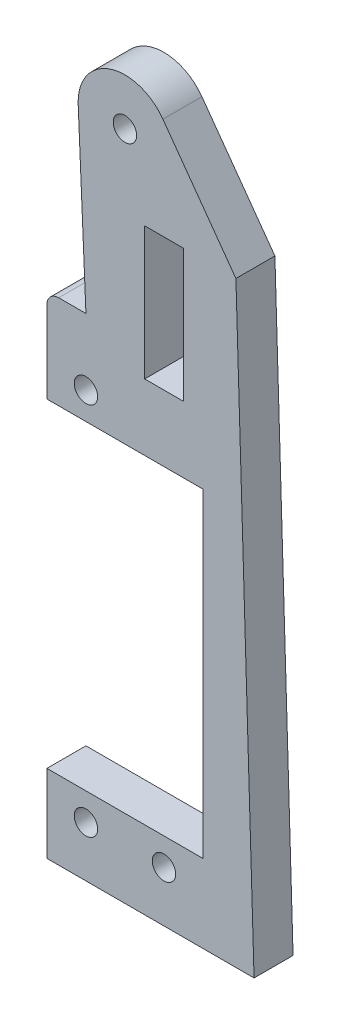
ISO-10303-21;
HEADER;
FILE_DESCRIPTION(('STEP AP214'),'2;1');
FILE_NAME('part.step','',(''),(''),'','','');
FILE_SCHEMA(('AUTOMOTIVE_DESIGN { 1 0 10303 214 1 1 1 1 }'));
ENDSEC;
DATA;
#1=APPLICATION_CONTEXT('core data for automotive mechanical design processes');
#2=APPLICATION_PROTOCOL_DEFINITION('international standard','automotive_design',2000,#1);
#3=PRODUCT_CONTEXT('',#1,'mechanical');
#4=PRODUCT('Part','Part','',(#3));
#5=PRODUCT_RELATED_PRODUCT_CATEGORY('part','',(#4));
#6=PRODUCT_DEFINITION_FORMATION('','',#4);
#7=PRODUCT_DEFINITION_CONTEXT('part definition',#1,'design');
#8=PRODUCT_DEFINITION('design','',#6,#7);
#9=PRODUCT_DEFINITION_SHAPE('','',#8);
#10=(LENGTH_UNIT() NAMED_UNIT(*) SI_UNIT(.MILLI.,.METRE.));
#11=(NAMED_UNIT(*) PLANE_ANGLE_UNIT() SI_UNIT($,.RADIAN.));
#12=(NAMED_UNIT(*) SI_UNIT($,.STERADIAN.) SOLID_ANGLE_UNIT());
#13=UNCERTAINTY_MEASURE_WITH_UNIT(LENGTH_MEASURE(1.E-05),#10,'distance_accuracy_value','');
#14=(GEOMETRIC_REPRESENTATION_CONTEXT(3) GLOBAL_UNCERTAINTY_ASSIGNED_CONTEXT((#13)) GLOBAL_UNIT_ASSIGNED_CONTEXT((#10,
#11,#12)) REPRESENTATION_CONTEXT('',''));
#15=CARTESIAN_POINT('',(0.,0.,0.));
#16=DIRECTION('',(0.,0.,1.));
#17=DIRECTION('',(1.,0.,0.));
#18=AXIS2_PLACEMENT_3D('',#15,#16,#17);
#19=CARTESIAN_POINT('',(17.5288568297002,0.,5.));
#20=DIRECTION('',(-1.,0.,0.));
#21=DIRECTION('',(0.,0.,1.));
#22=AXIS2_PLACEMENT_3D('',#19,#20,#21);
#23=PLANE('',#22);
#24=DIRECTION('',(0.,1.,0.));
#25=VECTOR('',#24,1.);
#26=CARTESIAN_POINT('',(17.5288568297002,0.,0.));
#27=LINE('',#26,#25);
#28=CARTESIAN_POINT('',(17.5288568297002,59.4999999999998,0.));
#29=VERTEX_POINT('',#28);
#30=CARTESIAN_POINT('',(17.5288568297002,76.4999999999998,0.));
#31=VERTEX_POINT('',#30);
#32=EDGE_CURVE('E251',#29,#31,#27,.T.);
#33=ORIENTED_EDGE('',*,*,#32,.F.);
#34=DIRECTION('',(0.,0.,-1.));
#35=VECTOR('',#34,1.);
#36=CARTESIAN_POINT('',(17.5288568297002,59.4999999999998,5.));
#37=LINE('',#36,#35);
#38=CARTESIAN_POINT('',(17.5288568297002,59.4999999999998,5.));
#39=VERTEX_POINT('',#38);
#40=EDGE_CURVE('E273',#39,#29,#37,.T.);
#41=ORIENTED_EDGE('',*,*,#40,.F.);
#42=DIRECTION('',(0.,1.,0.));
#43=VECTOR('',#42,1.);
#44=CARTESIAN_POINT('',(17.5288568297002,0.,5.));
#45=LINE('',#44,#43);
#46=CARTESIAN_POINT('',(17.5288568297002,76.4999999999998,5.));
#47=VERTEX_POINT('',#46);
#48=EDGE_CURVE('E201',#39,#47,#45,.T.);
#49=ORIENTED_EDGE('',*,*,#48,.T.);
#50=DIRECTION('',(0.,0.,-1.));
#51=VECTOR('',#50,1.);
#52=CARTESIAN_POINT('',(17.5288568297002,76.4999999999998,5.));
#53=LINE('',#52,#51);
#54=EDGE_CURVE('E157',#47,#31,#53,.T.);
#55=ORIENTED_EDGE('',*,*,#54,.T.);
#56=EDGE_LOOP('',(#33,#41,#49,#55));
#57=FACE_BOUND('',#56,.T.);
#58=ADVANCED_FACE('F35',(#57),#23,.T.);
#59=CARTESIAN_POINT('',(0.,59.4999999999998,5.));
#60=DIRECTION('',(0.,1.,0.));
#61=DIRECTION('',(0.,0.,1.));
#62=AXIS2_PLACEMENT_3D('',#59,#60,#61);
#63=PLANE('',#62);
#64=DIRECTION('',(1.,0.,0.));
#65=VECTOR('',#64,1.);
#66=CARTESIAN_POINT('',(0.,59.4999999999998,0.));
#67=LINE('',#66,#65);
#68=CARTESIAN_POINT('',(12.5288568297002,59.4999999999998,0.));
#69=VERTEX_POINT('',#68);
#70=EDGE_CURVE('E254',#69,#29,#67,.T.);
#71=ORIENTED_EDGE('',*,*,#70,.F.);
#72=DIRECTION('',(0.,0.,-1.));
#73=VECTOR('',#72,1.);
#74=CARTESIAN_POINT('',(12.5288568297002,59.4999999999998,5.));
#75=LINE('',#74,#73);
#76=CARTESIAN_POINT('',(12.5288568297002,59.4999999999998,5.));
#77=VERTEX_POINT('',#76);
#78=EDGE_CURVE('E271',#77,#69,#75,.T.);
#79=ORIENTED_EDGE('',*,*,#78,.F.);
#80=DIRECTION('',(1.,0.,0.));
#81=VECTOR('',#80,1.);
#82=CARTESIAN_POINT('',(0.,59.4999999999998,5.));
#83=LINE('',#82,#81);
#84=EDGE_CURVE('E204',#77,#39,#83,.T.);
#85=ORIENTED_EDGE('',*,*,#84,.T.);
#86=ORIENTED_EDGE('',*,*,#40,.T.);
#87=EDGE_LOOP('',(#71,#79,#85,#86));
#88=FACE_BOUND('',#87,.T.);
#89=ADVANCED_FACE('F342',(#88),#63,.T.);
#90=CARTESIAN_POINT('',(12.5288568297002,0.,5.));
#91=DIRECTION('',(1.,0.,0.));
#92=DIRECTION('',(0.,1.,0.));
#93=AXIS2_PLACEMENT_3D('',#90,#91,#92);
#94=PLANE('',#93);
#95=DIRECTION('',(0.,-1.,0.));
#96=VECTOR('',#95,1.);
#97=CARTESIAN_POINT('',(12.5288568297002,0.,0.));
#98=LINE('',#97,#96);
#99=CARTESIAN_POINT('',(12.5288568297002,76.4999999999998,0.));
#100=VERTEX_POINT('',#99);
#101=EDGE_CURVE('E257',#100,#69,#98,.T.);
#102=ORIENTED_EDGE('',*,*,#101,.F.);
#103=DIRECTION('',(0.,0.,-1.));
#104=VECTOR('',#103,1.);
#105=CARTESIAN_POINT('',(12.5288568297002,76.4999999999998,5.));
#106=LINE('',#105,#104);
#107=CARTESIAN_POINT('',(12.5288568297002,76.4999999999998,5.));
#108=VERTEX_POINT('',#107);
#109=EDGE_CURVE('E269',#108,#100,#106,.T.);
#110=ORIENTED_EDGE('',*,*,#109,.F.);
#111=DIRECTION('',(0.,-1.,0.));
#112=VECTOR('',#111,1.);
#113=CARTESIAN_POINT('',(12.5288568297002,0.,5.));
#114=LINE('',#113,#112);
#115=EDGE_CURVE('E207',#108,#77,#114,.T.);
#116=ORIENTED_EDGE('',*,*,#115,.T.);
#117=ORIENTED_EDGE('',*,*,#78,.T.);
#118=EDGE_LOOP('',(#102,#110,#116,#117));
#119=FACE_BOUND('',#118,.T.);
#120=ADVANCED_FACE('F348',(#119),#94,.T.);
#121=CARTESIAN_POINT('',(9.99999999999968,85.9999999999998,5.));
#122=DIRECTION('',(0.,0.,-1.));
#123=DIRECTION('',(-1.,0.,0.));
#124=AXIS2_PLACEMENT_3D('',#121,#122,#123);
#125=CYLINDRICAL_SURFACE('',#124,6.00000000000001);
#126=CARTESIAN_POINT('',(9.99999999999968,85.9999999999998,0.));
#127=DIRECTION('',(0.,0.,1.));
#128=DIRECTION('',(1.,0.,0.));
#129=AXIS2_PLACEMENT_3D('',#126,#127,#128);
#130=CIRCLE('',#129,6.00000000000001);
#131=CARTESIAN_POINT('',(4.00572808162328,85.7378851996468,0.));
#132=VERTEX_POINT('',#131);
#133=CARTESIAN_POINT('',(14.8704483134795,89.5041023423583,0.));
#134=VERTEX_POINT('',#133);
#135=EDGE_CURVE('E153',#132,#134,#130,.F.);
#136=ORIENTED_EDGE('',*,*,#135,.F.);
#137=DIRECTION('',(0.,0.,-1.));
#138=VECTOR('',#137,1.);
#139=CARTESIAN_POINT('',(4.00572808162328,85.7378851996468,5.));
#140=LINE('',#139,#138);
#141=CARTESIAN_POINT('',(4.00572808162328,85.7378851996468,5.));
#142=VERTEX_POINT('',#141);
#143=EDGE_CURVE('E146',#142,#132,#140,.T.);
#144=ORIENTED_EDGE('',*,*,#143,.F.);
#145=CARTESIAN_POINT('',(9.99999999999968,85.9999999999998,5.));
#146=DIRECTION('',(0.,0.,1.));
#147=DIRECTION('',(1.,0.,0.));
#148=AXIS2_PLACEMENT_3D('',#145,#146,#147);
#149=CIRCLE('',#148,6.00000000000001);
#150=CARTESIAN_POINT('',(14.8704483134795,89.5041023423583,5.));
#151=VERTEX_POINT('',#150);
#152=EDGE_CURVE('E150',#142,#151,#149,.F.);
#153=ORIENTED_EDGE('',*,*,#152,.T.);
#154=DIRECTION('',(0.,0.,-1.));
#155=VECTOR('',#154,1.);
#156=CARTESIAN_POINT('',(14.8704483134795,89.5041023423583,5.));
#157=LINE('',#156,#155);
#158=EDGE_CURVE('E221',#151,#134,#157,.T.);
#159=ORIENTED_EDGE('',*,*,#158,.T.);
#160=EDGE_LOOP('',(#136,#144,#153,#159));
#161=FACE_BOUND('',#160,.T.);
#162=ADVANCED_FACE('F148',(#161),#125,.T.);
#163=CARTESIAN_POINT('',(7.74003568187344,0.33845276542429,5.));
#164=DIRECTION('',(0.9990453197294,0.0436858000588399,0.));
#165=DIRECTION('',(-0.0436858000588399,0.9990453197294,0.));
#166=AXIS2_PLACEMENT_3D('',#163,#164,#165);
#167=PLANE('',#166);
#168=DIRECTION('',(0.0436858000588399,-0.9990453197294,0.));
#169=VECTOR('',#168,1.);
#170=CARTESIAN_POINT('',(7.74003568187344,0.33845276542429,0.));
#171=LINE('',#170,#169);
#172=CARTESIAN_POINT('',(4.99999999999999,63.,0.));
#173=VERTEX_POINT('',#172);
#174=EDGE_CURVE('E223',#132,#173,#171,.T.);
#175=ORIENTED_EDGE('',*,*,#174,.T.);
#176=DIRECTION('',(0.,0.,-1.));
#177=VECTOR('',#176,1.);
#178=CARTESIAN_POINT('',(4.99999999999999,63.,5.));
#179=LINE('',#178,#177);
#180=CARTESIAN_POINT('',(4.99999999999999,63.,5.));
#181=VERTEX_POINT('',#180);
#182=EDGE_CURVE('E158',#181,#173,#179,.T.);
#183=ORIENTED_EDGE('',*,*,#182,.F.);
#184=DIRECTION('',(0.0436858000588399,-0.9990453197294,0.));
#185=VECTOR('',#184,1.);
#186=CARTESIAN_POINT('',(7.74003568187344,0.33845276542429,5.));
#187=LINE('',#186,#185);
#188=EDGE_CURVE('E162',#142,#181,#187,.T.);
#189=ORIENTED_EDGE('',*,*,#188,.F.);
#190=ORIENTED_EDGE('',*,*,#143,.T.);
#191=EDGE_LOOP('',(#175,#183,#189,#190));
#192=FACE_BOUND('',#191,.T.);
#193=ADVANCED_FACE('F163',(#192),#167,.F.);
#194=CARTESIAN_POINT('',(3.49720252756921E-13,63.,5.));
#195=DIRECTION('',(0.,1.,0.));
#196=DIRECTION('',(-1.,0.,0.));
#197=AXIS2_PLACEMENT_3D('',#194,#195,#196);
#198=PLANE('',#197);
#199=DIRECTION('',(1.,0.,0.));
#200=VECTOR('',#199,1.);
#201=CARTESIAN_POINT('',(3.49720252756921E-13,63.,0.));
#202=LINE('',#201,#200);
#203=CARTESIAN_POINT('',(1.49999999999996,63.,0.));
#204=VERTEX_POINT('',#203);
#205=EDGE_CURVE('E225',#204,#173,#202,.T.);
#206=ORIENTED_EDGE('',*,*,#205,.F.);
#207=DIRECTION('',(0.,0.,-1.));
#208=VECTOR('',#207,1.);
#209=CARTESIAN_POINT('',(1.49999999999996,63.,5.));
#210=LINE('',#209,#208);
#211=CARTESIAN_POINT('',(1.49999999999996,63.,5.));
#212=VERTEX_POINT('',#211);
#213=EDGE_CURVE('E43',#204,#212,#210,.F.);
#214=ORIENTED_EDGE('',*,*,#213,.T.);
#215=DIRECTION('',(1.,0.,0.));
#216=VECTOR('',#215,1.);
#217=CARTESIAN_POINT('',(3.49720252756921E-13,63.,5.));
#218=LINE('',#217,#216);
#219=EDGE_CURVE('E166',#212,#181,#218,.T.);
#220=ORIENTED_EDGE('',*,*,#219,.T.);
#221=ORIENTED_EDGE('',*,*,#182,.T.);
#222=EDGE_LOOP('',(#206,#214,#220,#221));
#223=FACE_BOUND('',#222,.T.);
#224=ADVANCED_FACE('F335',(#223),#198,.T.);
#225=CARTESIAN_POINT('',(0.,0.,5.));
#226=DIRECTION('',(1.,0.,0.));
#227=DIRECTION('',(0.,1.,0.));
#228=AXIS2_PLACEMENT_3D('',#225,#226,#227);
#229=PLANE('',#228);
#230=DIRECTION('',(0.,-1.,0.));
#231=VECTOR('',#230,1.);
#232=CARTESIAN_POINT('',(0.,0.,5.));
#233=LINE('',#232,#231);
#234=CARTESIAN_POINT('',(0.,61.5,5.));
#235=VERTEX_POINT('',#234);
#236=CARTESIAN_POINT('',(0.,51.,5.));
#237=VERTEX_POINT('',#236);
#238=EDGE_CURVE('E180',#235,#237,#233,.T.);
#239=ORIENTED_EDGE('',*,*,#238,.F.);
#240=DIRECTION('',(0.,0.,-1.));
#241=VECTOR('',#240,1.);
#242=CARTESIAN_POINT('',(0.,61.5,0.));
#243=LINE('',#242,#241);
#244=CARTESIAN_POINT('',(0.,61.5,0.));
#245=VERTEX_POINT('',#244);
#246=EDGE_CURVE('E275',#235,#245,#243,.T.);
#247=ORIENTED_EDGE('',*,*,#246,.T.);
#248=DIRECTION('',(0.,-1.,0.));
#249=VECTOR('',#248,1.);
#250=CARTESIAN_POINT('',(0.,0.,0.));
#251=LINE('',#250,#249);
#252=CARTESIAN_POINT('',(0.,51.,0.));
#253=VERTEX_POINT('',#252);
#254=EDGE_CURVE('E227',#245,#253,#251,.T.);
#255=ORIENTED_EDGE('',*,*,#254,.T.);
#256=DIRECTION('',(0.,0.,-1.));
#257=VECTOR('',#256,1.);
#258=CARTESIAN_POINT('',(0.,51.,5.));
#259=LINE('',#258,#257);
#260=EDGE_CURVE('E291',#237,#253,#259,.T.);
#261=ORIENTED_EDGE('',*,*,#260,.F.);
#262=EDGE_LOOP('',(#239,#247,#255,#261));
#263=FACE_BOUND('',#262,.T.);
#264=ADVANCED_FACE('F300',(#263),#229,.F.);
#265=CARTESIAN_POINT('',(0.,51.,5.));
#266=DIRECTION('',(0.,-1.,0.));
#267=DIRECTION('',(0.,0.,-1.));
#268=AXIS2_PLACEMENT_3D('',#265,#266,#267);
#269=PLANE('',#268);
#270=DIRECTION('',(-1.,0.,0.));
#271=VECTOR('',#270,1.);
#272=CARTESIAN_POINT('',(0.,51.,0.));
#273=LINE('',#272,#271);
#274=CARTESIAN_POINT('',(20.,51.,0.));
#275=VERTEX_POINT('',#274);
#276=EDGE_CURVE('E229',#275,#253,#273,.T.);
#277=ORIENTED_EDGE('',*,*,#276,.F.);
#278=DIRECTION('',(0.,0.,-1.));
#279=VECTOR('',#278,1.);
#280=CARTESIAN_POINT('',(20.,51.,5.));
#281=LINE('',#280,#279);
#282=CARTESIAN_POINT('',(20.,51.,5.));
#283=VERTEX_POINT('',#282);
#284=EDGE_CURVE('E289',#283,#275,#281,.T.);
#285=ORIENTED_EDGE('',*,*,#284,.F.);
#286=DIRECTION('',(-1.,0.,0.));
#287=VECTOR('',#286,1.);
#288=CARTESIAN_POINT('',(0.,51.,5.));
#289=LINE('',#288,#287);
#290=EDGE_CURVE('E182',#283,#237,#289,.T.);
#291=ORIENTED_EDGE('',*,*,#290,.T.);
#292=ORIENTED_EDGE('',*,*,#260,.T.);
#293=EDGE_LOOP('',(#277,#285,#291,#292));
#294=FACE_BOUND('',#293,.T.);
#295=ADVANCED_FACE('F310',(#294),#269,.T.);
#296=CARTESIAN_POINT('',(19.9999999999999,0.,5.));
#297=DIRECTION('',(-1.,0.,0.));
#298=DIRECTION('',(0.,-1.,0.));
#299=AXIS2_PLACEMENT_3D('',#296,#297,#298);
#300=PLANE('',#299);
#301=DIRECTION('',(0.,1.,0.));
#302=VECTOR('',#301,1.);
#303=CARTESIAN_POINT('',(19.9999999999999,0.,0.));
#304=LINE('',#303,#302);
#305=CARTESIAN_POINT('',(19.9999999999999,10.,0.));
#306=VERTEX_POINT('',#305);
#307=EDGE_CURVE('E232',#306,#275,#304,.T.);
#308=ORIENTED_EDGE('',*,*,#307,.F.);
#309=DIRECTION('',(0.,0.,-1.));
#310=VECTOR('',#309,1.);
#311=CARTESIAN_POINT('',(19.9999999999999,10.,5.));
#312=LINE('',#311,#310);
#313=CARTESIAN_POINT('',(19.9999999999999,10.,5.));
#314=VERTEX_POINT('',#313);
#315=EDGE_CURVE('E287',#314,#306,#312,.T.);
#316=ORIENTED_EDGE('',*,*,#315,.F.);
#317=DIRECTION('',(0.,1.,0.));
#318=VECTOR('',#317,1.);
#319=CARTESIAN_POINT('',(19.9999999999999,0.,5.));
#320=LINE('',#319,#318);
#321=EDGE_CURVE('E185',#314,#283,#320,.T.);
#322=ORIENTED_EDGE('',*,*,#321,.T.);
#323=ORIENTED_EDGE('',*,*,#284,.T.);
#324=EDGE_LOOP('',(#308,#316,#322,#323));
#325=FACE_BOUND('',#324,.T.);
#326=ADVANCED_FACE('F314',(#325),#300,.T.);
#327=CARTESIAN_POINT('',(0.,10.,5.));
#328=DIRECTION('',(0.,-1.,0.));
#329=DIRECTION('',(1.,0.,0.));
#330=AXIS2_PLACEMENT_3D('',#327,#328,#329);
#331=PLANE('',#330);
#332=DIRECTION('',(-1.,0.,0.));
#333=VECTOR('',#332,1.);
#334=CARTESIAN_POINT('',(0.,10.,0.));
#335=LINE('',#334,#333);
#336=CARTESIAN_POINT('',(0.,10.,0.));
#337=VERTEX_POINT('',#336);
#338=EDGE_CURVE('E235',#306,#337,#335,.T.);
#339=ORIENTED_EDGE('',*,*,#338,.T.);
#340=DIRECTION('',(0.,0.,-1.));
#341=VECTOR('',#340,1.);
#342=CARTESIAN_POINT('',(0.,10.,5.));
#343=LINE('',#342,#341);
#344=CARTESIAN_POINT('',(0.,10.,5.));
#345=VERTEX_POINT('',#344);
#346=EDGE_CURVE('E284',#345,#337,#343,.T.);
#347=ORIENTED_EDGE('',*,*,#346,.F.);
#348=DIRECTION('',(-1.,0.,0.));
#349=VECTOR('',#348,1.);
#350=CARTESIAN_POINT('',(0.,10.,5.));
#351=LINE('',#350,#349);
#352=EDGE_CURVE('E188',#314,#345,#351,.T.);
#353=ORIENTED_EDGE('',*,*,#352,.F.);
#354=ORIENTED_EDGE('',*,*,#315,.T.);
#355=EDGE_LOOP('',(#339,#347,#353,#354));
#356=FACE_BOUND('',#355,.T.);
#357=ADVANCED_FACE('F318',(#356),#331,.F.);
#358=CARTESIAN_POINT('',(0.,0.,5.));
#359=DIRECTION('',(1.,0.,0.));
#360=DIRECTION('',(0.,1.,0.));
#361=AXIS2_PLACEMENT_3D('',#358,#359,#360);
#362=PLANE('',#361);
#363=DIRECTION('',(0.,-1.,0.));
#364=VECTOR('',#363,1.);
#365=CARTESIAN_POINT('',(0.,0.,0.));
#366=LINE('',#365,#364);
#367=CARTESIAN_POINT('',(0.,0.,0.));
#368=VERTEX_POINT('',#367);
#369=EDGE_CURVE('E237',#337,#368,#366,.T.);
#370=ORIENTED_EDGE('',*,*,#369,.T.);
#371=DIRECTION('',(0.,0.,-1.));
#372=VECTOR('',#371,1.);
#373=CARTESIAN_POINT('',(0.,0.,5.));
#374=LINE('',#373,#372);
#375=CARTESIAN_POINT('',(0.,0.,5.));
#376=VERTEX_POINT('',#375);
#377=EDGE_CURVE('E281',#376,#368,#374,.T.);
#378=ORIENTED_EDGE('',*,*,#377,.F.);
#379=DIRECTION('',(0.,-1.,0.));
#380=VECTOR('',#379,1.);
#381=CARTESIAN_POINT('',(0.,0.,5.));
#382=LINE('',#381,#380);
#383=EDGE_CURVE('E190',#345,#376,#382,.T.);
#384=ORIENTED_EDGE('',*,*,#383,.F.);
#385=ORIENTED_EDGE('',*,*,#346,.T.);
#386=EDGE_LOOP('',(#370,#378,#384,#385));
#387=FACE_BOUND('',#386,.T.);
#388=ADVANCED_FACE('F324',(#387),#362,.F.);
#389=CARTESIAN_POINT('',(0.,0.,5.));
#390=DIRECTION('',(0.,1.,0.));
#391=DIRECTION('',(-1.,0.,0.));
#392=AXIS2_PLACEMENT_3D('',#389,#390,#391);
#393=PLANE('',#392);
#394=DIRECTION('',(1.,0.,0.));
#395=VECTOR('',#394,1.);
#396=CARTESIAN_POINT('',(0.,0.,0.));
#397=LINE('',#396,#395);
#398=CARTESIAN_POINT('',(26.5541314453759,0.,0.));
#399=VERTEX_POINT('',#398);
#400=EDGE_CURVE('E239',#368,#399,#397,.T.);
#401=ORIENTED_EDGE('',*,*,#400,.T.);
#402=DIRECTION('',(0.,0.,-1.));
#403=VECTOR('',#402,1.);
#404=CARTESIAN_POINT('',(26.5541314453759,0.,5.));
#405=LINE('',#404,#403);
#406=CARTESIAN_POINT('',(26.5541314453759,0.,5.));
#407=VERTEX_POINT('',#406);
#408=EDGE_CURVE('E279',#407,#399,#405,.T.);
#409=ORIENTED_EDGE('',*,*,#408,.F.);
#410=DIRECTION('',(1.,0.,0.));
#411=VECTOR('',#410,1.);
#412=CARTESIAN_POINT('',(0.,0.,5.));
#413=LINE('',#412,#411);
#414=EDGE_CURVE('E192',#376,#407,#413,.T.);
#415=ORIENTED_EDGE('',*,*,#414,.F.);
#416=ORIENTED_EDGE('',*,*,#377,.T.);
#417=EDGE_LOOP('',(#401,#409,#415,#416));
#418=FACE_BOUND('',#417,.T.);
#419=ADVANCED_FACE('F328',(#418),#393,.F.);
#420=CARTESIAN_POINT('',(26.5295690311156,0.807236188911825,5.));
#421=DIRECTION('',(0.999537395961129,0.0304137152489801,0.));
#422=DIRECTION('',(-0.0304137152489801,0.999537395961129,0.));
#423=AXIS2_PLACEMENT_3D('',#420,#421,#422);
#424=PLANE('',#423);
#425=DIRECTION('',(0.0304137152489801,-0.999537395961129,0.));
#426=VECTOR('',#425,1.);
#427=CARTESIAN_POINT('',(26.5295690311156,0.807236188911825,0.));
#428=LINE('',#427,#426);
#429=CARTESIAN_POINT('',(24.2264054133651,76.4999999999998,0.));
#430=VERTEX_POINT('',#429);
#431=EDGE_CURVE('E242',#430,#399,#428,.T.);
#432=ORIENTED_EDGE('',*,*,#431,.F.);
#433=DIRECTION('',(0.,0.,-1.));
#434=VECTOR('',#433,1.);
#435=CARTESIAN_POINT('',(24.2264054133651,76.4999999999998,5.));
#436=LINE('',#435,#434);
#437=CARTESIAN_POINT('',(24.2264054133651,76.4999999999998,5.));
#438=VERTEX_POINT('',#437);
#439=EDGE_CURVE('E277',#438,#430,#436,.T.);
#440=ORIENTED_EDGE('',*,*,#439,.F.);
#441=DIRECTION('',(0.0304137152489801,-0.999537395961129,0.));
#442=VECTOR('',#441,1.);
#443=CARTESIAN_POINT('',(26.5295690311156,0.807236188911825,5.));
#444=LINE('',#443,#442);
#445=EDGE_CURVE('E194',#438,#407,#444,.T.);
#446=ORIENTED_EDGE('',*,*,#445,.T.);
#447=ORIENTED_EDGE('',*,*,#408,.T.);
#448=EDGE_LOOP('',(#432,#440,#446,#447));
#449=FACE_BOUND('',#448,.T.);
#450=ADVANCED_FACE('F331',(#449),#424,.T.);
#451=CARTESIAN_POINT('',(15.,6.50000000000002,5.));
#452=DIRECTION('',(0.,0.,-1.));
#453=DIRECTION('',(-1.,0.,0.));
#454=AXIS2_PLACEMENT_3D('',#451,#452,#453);
#455=CYLINDRICAL_SURFACE('',#454,1.5);
#456=CARTESIAN_POINT('',(15.,6.50000000000002,5.));
#457=DIRECTION('',(0.,0.,1.));
#458=DIRECTION('',(1.,0.,0.));
#459=AXIS2_PLACEMENT_3D('',#456,#457,#458);
#460=CIRCLE('',#459,1.5);
#461=CARTESIAN_POINT('',(16.5,6.50000000000002,5.));
#462=VERTEX_POINT('',#461);
#463=EDGE_CURVE('E215',#462,#462,#460,.T.);
#464=ORIENTED_EDGE('',*,*,#463,.T.);
#465=EDGE_LOOP('',(#464));
#466=FACE_BOUND('',#465,.T.);
#467=CARTESIAN_POINT('',(15.,6.50000000000002,0.));
#468=DIRECTION('',(0.,0.,1.));
#469=DIRECTION('',(1.,0.,0.));
#470=AXIS2_PLACEMENT_3D('',#467,#468,#469);
#471=CIRCLE('',#470,1.5);
#472=CARTESIAN_POINT('',(16.5,6.50000000000002,0.));
#473=VERTEX_POINT('',#472);
#474=EDGE_CURVE('E176',#473,#473,#471,.T.);
#475=ORIENTED_EDGE('',*,*,#474,.F.);
#476=EDGE_LOOP('',(#475));
#477=FACE_BOUND('',#476,.T.);
#478=ADVANCED_FACE('F364',(#466,#477),#455,.F.);
#479=CARTESIAN_POINT('',(4.99999999999995,54.5,5.));
#480=DIRECTION('',(0.,0.,-1.));
#481=DIRECTION('',(-1.,0.,0.));
#482=AXIS2_PLACEMENT_3D('',#479,#480,#481);
#483=CYLINDRICAL_SURFACE('',#482,1.5);
#484=CARTESIAN_POINT('',(4.99999999999995,54.5,5.));
#485=DIRECTION('',(0.,0.,1.));
#486=DIRECTION('',(1.,0.,0.));
#487=AXIS2_PLACEMENT_3D('',#484,#485,#486);
#488=CIRCLE('',#487,1.5);
#489=CARTESIAN_POINT('',(6.49999999999995,54.5,5.));
#490=VERTEX_POINT('',#489);
#491=EDGE_CURVE('E212',#490,#490,#488,.T.);
#492=ORIENTED_EDGE('',*,*,#491,.T.);
#493=EDGE_LOOP('',(#492));
#494=FACE_BOUND('',#493,.T.);
#495=CARTESIAN_POINT('',(4.99999999999995,54.5,0.));
#496=DIRECTION('',(0.,0.,1.));
#497=DIRECTION('',(1.,0.,0.));
#498=AXIS2_PLACEMENT_3D('',#495,#496,#497);
#499=CIRCLE('',#498,1.5);
#500=CARTESIAN_POINT('',(6.49999999999995,54.5,0.));
#501=VERTEX_POINT('',#500);
#502=EDGE_CURVE('E263',#501,#501,#499,.T.);
#503=ORIENTED_EDGE('',*,*,#502,.F.);
#504=EDGE_LOOP('',(#503));
#505=FACE_BOUND('',#504,.T.);
#506=ADVANCED_FACE('F391',(#494,#505),#483,.F.);
#507=CARTESIAN_POINT('',(0.,76.4999999999998,5.));
#508=DIRECTION('',(0.,1.,0.));
#509=DIRECTION('',(0.,0.,1.));
#510=AXIS2_PLACEMENT_3D('',#507,#508,#509);
#511=PLANE('',#510);
#512=DIRECTION('',(1.,0.,0.));
#513=VECTOR('',#512,1.);
#514=CARTESIAN_POINT('',(0.,76.4999999999998,0.));
#515=LINE('',#514,#513);
#516=EDGE_CURVE('E260',#100,#31,#515,.T.);
#517=ORIENTED_EDGE('',*,*,#516,.T.);
#518=ORIENTED_EDGE('',*,*,#54,.F.);
#519=DIRECTION('',(1.,0.,0.));
#520=VECTOR('',#519,1.);
#521=CARTESIAN_POINT('',(0.,76.4999999999998,5.));
#522=LINE('',#521,#520);
#523=EDGE_CURVE('E210',#108,#47,#522,.T.);
#524=ORIENTED_EDGE('',*,*,#523,.F.);
#525=ORIENTED_EDGE('',*,*,#109,.T.);
#526=EDGE_LOOP('',(#517,#518,#524,#525));
#527=FACE_BOUND('',#526,.T.);
#528=ADVANCED_FACE('F357',(#527),#511,.F.);
#529=CARTESIAN_POINT('',(9.99999999999968,85.9999999999998,5.));
#530=DIRECTION('',(0.,0.,-1.));
#531=DIRECTION('',(-1.,0.,0.));
#532=AXIS2_PLACEMENT_3D('',#529,#530,#531);
#533=CYLINDRICAL_SURFACE('',#532,1.5);
#534=CARTESIAN_POINT('',(9.99999999999968,85.9999999999998,5.));
#535=DIRECTION('',(0.,0.,1.));
#536=DIRECTION('',(1.,0.,0.));
#537=AXIS2_PLACEMENT_3D('',#534,#535,#536);
#538=CIRCLE('',#537,1.5);
#539=CARTESIAN_POINT('',(11.4999999999997,85.9999999999998,5.));
#540=VERTEX_POINT('',#539);
#541=EDGE_CURVE('E198',#540,#540,#538,.T.);
#542=ORIENTED_EDGE('',*,*,#541,.T.);
#543=EDGE_LOOP('',(#542));
#544=FACE_BOUND('',#543,.T.);
#545=CARTESIAN_POINT('',(9.99999999999968,85.9999999999998,0.));
#546=DIRECTION('',(0.,0.,1.));
#547=DIRECTION('',(1.,0.,0.));
#548=AXIS2_PLACEMENT_3D('',#545,#546,#547);
#549=CIRCLE('',#548,1.5);
#550=CARTESIAN_POINT('',(11.4999999999997,85.9999999999998,0.));
#551=VERTEX_POINT('',#550);
#552=EDGE_CURVE('E248',#551,#551,#549,.T.);
#553=ORIENTED_EDGE('',*,*,#552,.F.);
#554=EDGE_LOOP('',(#553));
#555=FACE_BOUND('',#554,.T.);
#556=ADVANCED_FACE('F354',(#544,#555),#533,.F.);
#557=CARTESIAN_POINT('',(52.2297791827129,37.5773398659162,5.));
#558=DIRECTION('',(0.811741385579964,0.58401705705974,0.));
#559=DIRECTION('',(-0.58401705705974,0.811741385579964,0.));
#560=AXIS2_PLACEMENT_3D('',#557,#558,#559);
#561=PLANE('',#560);
#562=DIRECTION('',(0.58401705705974,-0.811741385579964,0.));
#563=VECTOR('',#562,1.);
#564=CARTESIAN_POINT('',(52.2297791827129,37.5773398659162,0.));
#565=LINE('',#564,#563);
#566=EDGE_CURVE('E245',#134,#430,#565,.T.);
#567=ORIENTED_EDGE('',*,*,#566,.F.);
#568=ORIENTED_EDGE('',*,*,#158,.F.);
#569=DIRECTION('',(0.58401705705974,-0.811741385579964,0.));
#570=VECTOR('',#569,1.);
#571=CARTESIAN_POINT('',(52.2297791827129,37.5773398659162,5.));
#572=LINE('',#571,#570);
#573=EDGE_CURVE('E172',#151,#438,#572,.T.);
#574=ORIENTED_EDGE('',*,*,#573,.T.);
#575=ORIENTED_EDGE('',*,*,#439,.T.);
#576=EDGE_LOOP('',(#567,#568,#574,#575));
#577=FACE_BOUND('',#576,.T.);
#578=ADVANCED_FACE('F334',(#577),#561,.T.);
#579=CARTESIAN_POINT('',(4.99999999999995,6.50000000000002,5.));
#580=DIRECTION('',(0.,0.,-1.));
#581=DIRECTION('',(-1.,0.,0.));
#582=AXIS2_PLACEMENT_3D('',#579,#580,#581);
#583=CYLINDRICAL_SURFACE('',#582,1.5);
#584=CARTESIAN_POINT('',(4.99999999999995,6.50000000000002,5.));
#585=DIRECTION('',(0.,0.,1.));
#586=DIRECTION('',(1.,0.,0.));
#587=AXIS2_PLACEMENT_3D('',#584,#585,#586);
#588=CIRCLE('',#587,1.5);
#589=CARTESIAN_POINT('',(6.49999999999995,6.50000000000002,5.));
#590=VERTEX_POINT('',#589);
#591=EDGE_CURVE('E218',#590,#590,#588,.F.);
#592=ORIENTED_EDGE('',*,*,#591,.F.);
#593=EDGE_LOOP('',(#592));
#594=FACE_BOUND('',#593,.T.);
#595=CARTESIAN_POINT('',(4.99999999999995,6.50000000000002,0.));
#596=DIRECTION('',(0.,0.,1.));
#597=DIRECTION('',(1.,0.,0.));
#598=AXIS2_PLACEMENT_3D('',#595,#596,#597);
#599=CIRCLE('',#598,1.5);
#600=CARTESIAN_POINT('',(6.49999999999995,6.50000000000002,0.));
#601=VERTEX_POINT('',#600);
#602=EDGE_CURVE('E173',#601,#601,#599,.F.);
#603=ORIENTED_EDGE('',*,*,#602,.T.);
#604=EDGE_LOOP('',(#603));
#605=FACE_BOUND('',#604,.T.);
#606=ADVANCED_FACE('F361',(#594,#605),#583,.F.);
#607=CARTESIAN_POINT('',(0.,0.,5.));
#608=DIRECTION('',(0.,0.,1.));
#609=DIRECTION('',(1.,0.,0.));
#610=AXIS2_PLACEMENT_3D('',#607,#608,#609);
#611=PLANE('',#610);
#612=ORIENTED_EDGE('',*,*,#219,.F.);
#613=CARTESIAN_POINT('',(1.49999999999995,61.5,5.));
#614=DIRECTION('',(0.,0.,1.));
#615=DIRECTION('',(1.,0.,0.));
#616=AXIS2_PLACEMENT_3D('',#613,#614,#615);
#617=CIRCLE('',#616,1.5);
#618=EDGE_CURVE('E11',#212,#235,#617,.T.);
#619=ORIENTED_EDGE('',*,*,#618,.T.);
#620=ORIENTED_EDGE('',*,*,#238,.T.);
#621=ORIENTED_EDGE('',*,*,#290,.F.);
#622=ORIENTED_EDGE('',*,*,#321,.F.);
#623=ORIENTED_EDGE('',*,*,#352,.T.);
#624=ORIENTED_EDGE('',*,*,#383,.T.);
#625=ORIENTED_EDGE('',*,*,#414,.T.);
#626=ORIENTED_EDGE('',*,*,#445,.F.);
#627=ORIENTED_EDGE('',*,*,#573,.F.);
#628=ORIENTED_EDGE('',*,*,#152,.F.);
#629=ORIENTED_EDGE('',*,*,#188,.T.);
#630=EDGE_LOOP('',(#612,#619,#620,#621,#622,#623,#624,#625,#626,#627,#628,#629));
#631=FACE_BOUND('',#630,.T.);
#632=ORIENTED_EDGE('',*,*,#541,.F.);
#633=EDGE_LOOP('',(#632));
#634=FACE_BOUND('',#633,.T.);
#635=ORIENTED_EDGE('',*,*,#48,.F.);
#636=ORIENTED_EDGE('',*,*,#84,.F.);
#637=ORIENTED_EDGE('',*,*,#115,.F.);
#638=ORIENTED_EDGE('',*,*,#523,.T.);
#639=EDGE_LOOP('',(#635,#636,#637,#638));
#640=FACE_BOUND('',#639,.T.);
#641=ORIENTED_EDGE('',*,*,#491,.F.);
#642=EDGE_LOOP('',(#641));
#643=FACE_BOUND('',#642,.T.);
#644=ORIENTED_EDGE('',*,*,#463,.F.);
#645=EDGE_LOOP('',(#644));
#646=FACE_BOUND('',#645,.T.);
#647=ORIENTED_EDGE('',*,*,#591,.T.);
#648=EDGE_LOOP('',(#647));
#649=FACE_BOUND('',#648,.T.);
#650=ADVANCED_FACE('F168',(#631,#634,#640,#643,#646,#649),#611,.T.);
#651=CARTESIAN_POINT('',(0.,0.,0.));
#652=DIRECTION('',(0.,0.,1.));
#653=DIRECTION('',(1.,0.,0.));
#654=AXIS2_PLACEMENT_3D('',#651,#652,#653);
#655=PLANE('',#654);
#656=ORIENTED_EDGE('',*,*,#254,.F.);
#657=CARTESIAN_POINT('',(1.49999999999995,61.5,0.));
#658=DIRECTION('',(0.,0.,1.));
#659=DIRECTION('',(1.,0.,0.));
#660=AXIS2_PLACEMENT_3D('',#657,#658,#659);
#661=CIRCLE('',#660,1.5);
#662=EDGE_CURVE('E57',#245,#204,#661,.F.);
#663=ORIENTED_EDGE('',*,*,#662,.T.);
#664=ORIENTED_EDGE('',*,*,#205,.T.);
#665=ORIENTED_EDGE('',*,*,#174,.F.);
#666=ORIENTED_EDGE('',*,*,#135,.T.);
#667=ORIENTED_EDGE('',*,*,#566,.T.);
#668=ORIENTED_EDGE('',*,*,#431,.T.);
#669=ORIENTED_EDGE('',*,*,#400,.F.);
#670=ORIENTED_EDGE('',*,*,#369,.F.);
#671=ORIENTED_EDGE('',*,*,#338,.F.);
#672=ORIENTED_EDGE('',*,*,#307,.T.);
#673=ORIENTED_EDGE('',*,*,#276,.T.);
#674=EDGE_LOOP('',(#656,#663,#664,#665,#666,#667,#668,#669,#670,#671,#672,#673));
#675=FACE_BOUND('',#674,.T.);
#676=ORIENTED_EDGE('',*,*,#552,.T.);
#677=EDGE_LOOP('',(#676));
#678=FACE_BOUND('',#677,.T.);
#679=ORIENTED_EDGE('',*,*,#32,.T.);
#680=ORIENTED_EDGE('',*,*,#516,.F.);
#681=ORIENTED_EDGE('',*,*,#101,.T.);
#682=ORIENTED_EDGE('',*,*,#70,.T.);
#683=EDGE_LOOP('',(#679,#680,#681,#682));
#684=FACE_BOUND('',#683,.T.);
#685=ORIENTED_EDGE('',*,*,#502,.T.);
#686=EDGE_LOOP('',(#685));
#687=FACE_BOUND('',#686,.T.);
#688=ORIENTED_EDGE('',*,*,#474,.T.);
#689=EDGE_LOOP('',(#688));
#690=FACE_BOUND('',#689,.T.);
#691=ORIENTED_EDGE('',*,*,#602,.F.);
#692=EDGE_LOOP('',(#691));
#693=FACE_BOUND('',#692,.T.);
#694=ADVANCED_FACE('F304',(#675,#678,#684,#687,#690,#693),#655,.F.);
#695=CARTESIAN_POINT('',(1.49999999999995,61.5,5.));
#696=DIRECTION('',(0.,0.,1.));
#697=DIRECTION('',(1.,0.,0.));
#698=AXIS2_PLACEMENT_3D('',#695,#696,#697);
#699=CYLINDRICAL_SURFACE('',#698,1.5);
#700=ORIENTED_EDGE('',*,*,#618,.F.);
#701=ORIENTED_EDGE('',*,*,#213,.F.);
#702=ORIENTED_EDGE('',*,*,#662,.F.);
#703=ORIENTED_EDGE('',*,*,#246,.F.);
#704=EDGE_LOOP('',(#700,#701,#702,#703));
#705=FACE_BOUND('',#704,.T.);
#706=ADVANCED_FACE('F37',(#705),#699,.T.);
#707=CLOSED_SHELL('',(#58,#89,#120,#162,#193,#224,#264,#295,#326,#357,#388,#419,#450,#478,#506,
#528,#556,#578,#606,#650,#694,#706));
#708=MANIFOLD_SOLID_BREP('B2',#707);
#709=ADVANCED_BREP_SHAPE_REPRESENTATION('',(#18,#708),#14);
#710=SHAPE_DEFINITION_REPRESENTATION(#9,#709);
ENDSEC;
END-ISO-10303-21;
